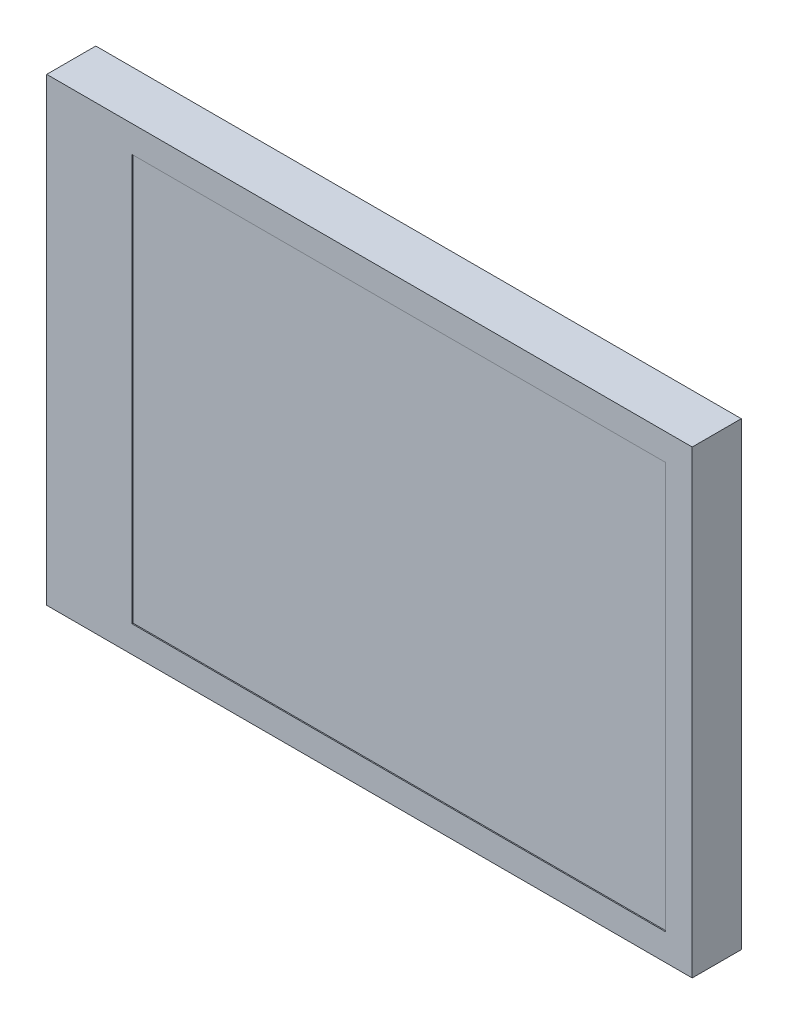
ISO-10303-21;
HEADER;
FILE_DESCRIPTION(('STEP AP214'),'2;1');
FILE_NAME('part.step','',(''),(''),'','','');
FILE_SCHEMA(('AUTOMOTIVE_DESIGN { 1 0 10303 214 1 1 1 1 }'));
ENDSEC;
DATA;
#1=APPLICATION_CONTEXT('core data for automotive mechanical design processes');
#2=APPLICATION_PROTOCOL_DEFINITION('international standard','automotive_design',2000,#1);
#3=PRODUCT_CONTEXT('',#1,'mechanical');
#4=PRODUCT('Part','Part','',(#3));
#5=PRODUCT_RELATED_PRODUCT_CATEGORY('part','',(#4));
#6=PRODUCT_DEFINITION_FORMATION('','',#4);
#7=PRODUCT_DEFINITION_CONTEXT('part definition',#1,'design');
#8=PRODUCT_DEFINITION('design','',#6,#7);
#9=PRODUCT_DEFINITION_SHAPE('','',#8);
#10=(LENGTH_UNIT() NAMED_UNIT(*) SI_UNIT(.MILLI.,.METRE.));
#11=(NAMED_UNIT(*) PLANE_ANGLE_UNIT() SI_UNIT($,.RADIAN.));
#12=(NAMED_UNIT(*) SI_UNIT($,.STERADIAN.) SOLID_ANGLE_UNIT());
#13=UNCERTAINTY_MEASURE_WITH_UNIT(LENGTH_MEASURE(1.E-05),#10,'distance_accuracy_value','');
#14=(GEOMETRIC_REPRESENTATION_CONTEXT(3) GLOBAL_UNCERTAINTY_ASSIGNED_CONTEXT((#13)) GLOBAL_UNIT_ASSIGNED_CONTEXT((#10,
#11,#12)) REPRESENTATION_CONTEXT('',''));
#15=CARTESIAN_POINT('',(0.,0.,0.));
#16=DIRECTION('',(0.,0.,1.));
#17=DIRECTION('',(1.,0.,0.));
#18=AXIS2_PLACEMENT_3D('',#15,#16,#17);
#19=CARTESIAN_POINT('',(28.25,-21.55,-2.));
#20=DIRECTION('',(-1.,0.,0.));
#21=DIRECTION('',(0.,-1.,0.));
#22=AXIS2_PLACEMENT_3D('',#19,#20,#21);
#23=PLANE('',#22);
#24=DIRECTION('',(0.,-1.,0.));
#25=VECTOR('',#24,1.);
#26=CARTESIAN_POINT('',(28.25,-21.55,0.));
#27=LINE('',#26,#25);
#28=CARTESIAN_POINT('',(28.25,-6.25,0.));
#29=VERTEX_POINT('',#28);
#30=CARTESIAN_POINT('',(28.25,-21.55,0.));
#31=VERTEX_POINT('',#30);
#32=EDGE_CURVE('E108',#29,#31,#27,.T.);
#33=ORIENTED_EDGE('',*,*,#32,.T.);
#34=DIRECTION('',(0.,0.,1.));
#35=VECTOR('',#34,1.);
#36=CARTESIAN_POINT('',(28.25,-21.55,-2.));
#37=LINE('',#36,#35);
#38=CARTESIAN_POINT('',(28.25,-21.55,-2.));
#39=VERTEX_POINT('',#38);
#40=EDGE_CURVE('E12',#39,#31,#37,.T.);
#41=ORIENTED_EDGE('',*,*,#40,.F.);
#42=DIRECTION('',(0.,-1.,0.));
#43=VECTOR('',#42,1.);
#44=CARTESIAN_POINT('',(28.25,-21.55,-2.));
#45=LINE('',#44,#43);
#46=CARTESIAN_POINT('',(28.25,-6.25,-2.));
#47=VERTEX_POINT('',#46);
#48=EDGE_CURVE('E96',#47,#39,#45,.T.);
#49=ORIENTED_EDGE('',*,*,#48,.F.);
#50=DIRECTION('',(0.,0.,1.));
#51=VECTOR('',#50,1.);
#52=CARTESIAN_POINT('',(28.25,-6.25,-2.));
#53=LINE('',#52,#51);
#54=EDGE_CURVE('E104',#47,#29,#53,.T.);
#55=ORIENTED_EDGE('',*,*,#54,.T.);
#56=EDGE_LOOP('',(#33,#41,#49,#55));
#57=FACE_BOUND('',#56,.T.);
#58=ADVANCED_FACE('F45',(#57),#23,.F.);
#59=CARTESIAN_POINT('',(28.25,-21.55,-2.));
#60=DIRECTION('',(0.,1.,0.));
#61=DIRECTION('',(0.,0.,1.));
#62=AXIS2_PLACEMENT_3D('',#59,#60,#61);
#63=PLANE('',#62);
#64=DIRECTION('',(-1.,0.,0.));
#65=VECTOR('',#64,1.);
#66=CARTESIAN_POINT('',(28.25,-21.55,0.));
#67=LINE('',#66,#65);
#68=CARTESIAN_POINT('',(13.45,-21.55,0.));
#69=VERTEX_POINT('',#68);
#70=EDGE_CURVE('E100',#31,#69,#67,.T.);
#71=ORIENTED_EDGE('',*,*,#70,.T.);
#72=DIRECTION('',(0.,0.,1.));
#73=VECTOR('',#72,1.);
#74=CARTESIAN_POINT('',(13.45,-21.55,-2.));
#75=LINE('',#74,#73);
#76=CARTESIAN_POINT('',(13.45,-21.55,-2.));
#77=VERTEX_POINT('',#76);
#78=EDGE_CURVE('E53',#77,#69,#75,.T.);
#79=ORIENTED_EDGE('',*,*,#78,.F.);
#80=DIRECTION('',(-1.,0.,0.));
#81=VECTOR('',#80,1.);
#82=CARTESIAN_POINT('',(28.25,-21.55,-2.));
#83=LINE('',#82,#81);
#84=EDGE_CURVE('E91',#39,#77,#83,.T.);
#85=ORIENTED_EDGE('',*,*,#84,.F.);
#86=ORIENTED_EDGE('',*,*,#40,.T.);
#87=EDGE_LOOP('',(#71,#79,#85,#86));
#88=FACE_BOUND('',#87,.T.);
#89=ADVANCED_FACE('F99',(#88),#63,.F.);
#90=CARTESIAN_POINT('',(13.45,-21.55,-2.));
#91=DIRECTION('',(1.,0.,0.));
#92=DIRECTION('',(0.,0.,-1.));
#93=AXIS2_PLACEMENT_3D('',#90,#91,#92);
#94=PLANE('',#93);
#95=DIRECTION('',(0.,1.,0.));
#96=VECTOR('',#95,1.);
#97=CARTESIAN_POINT('',(13.45,-21.55,0.));
#98=LINE('',#97,#96);
#99=CARTESIAN_POINT('',(13.45,-6.25,0.));
#100=VERTEX_POINT('',#99);
#101=EDGE_CURVE('E78',#69,#100,#98,.T.);
#102=ORIENTED_EDGE('',*,*,#101,.T.);
#103=DIRECTION('',(0.,0.,1.));
#104=VECTOR('',#103,1.);
#105=CARTESIAN_POINT('',(13.45,-6.25,-2.));
#106=LINE('',#105,#104);
#107=CARTESIAN_POINT('',(13.45,-6.25,-2.));
#108=VERTEX_POINT('',#107);
#109=EDGE_CURVE('E101',#108,#100,#106,.T.);
#110=ORIENTED_EDGE('',*,*,#109,.F.);
#111=DIRECTION('',(0.,1.,0.));
#112=VECTOR('',#111,1.);
#113=CARTESIAN_POINT('',(13.45,-21.55,-2.));
#114=LINE('',#113,#112);
#115=EDGE_CURVE('E94',#77,#108,#114,.T.);
#116=ORIENTED_EDGE('',*,*,#115,.F.);
#117=ORIENTED_EDGE('',*,*,#78,.T.);
#118=EDGE_LOOP('',(#102,#110,#116,#117));
#119=FACE_BOUND('',#118,.T.);
#120=ADVANCED_FACE('F102',(#119),#94,.F.);
#121=CARTESIAN_POINT('',(28.25,-6.25,-2.));
#122=DIRECTION('',(0.,-1.,0.));
#123=DIRECTION('',(0.,0.,-1.));
#124=AXIS2_PLACEMENT_3D('',#121,#122,#123);
#125=PLANE('',#124);
#126=DIRECTION('',(1.,0.,0.));
#127=VECTOR('',#126,1.);
#128=CARTESIAN_POINT('',(28.25,-6.25,0.));
#129=LINE('',#128,#127);
#130=EDGE_CURVE('E84',#100,#29,#129,.T.);
#131=ORIENTED_EDGE('',*,*,#130,.T.);
#132=ORIENTED_EDGE('',*,*,#54,.F.);
#133=DIRECTION('',(1.,0.,0.));
#134=VECTOR('',#133,1.);
#135=CARTESIAN_POINT('',(28.25,-6.25,-2.));
#136=LINE('',#135,#134);
#137=EDGE_CURVE('E61',#108,#47,#136,.T.);
#138=ORIENTED_EDGE('',*,*,#137,.F.);
#139=ORIENTED_EDGE('',*,*,#109,.T.);
#140=EDGE_LOOP('',(#131,#132,#138,#139));
#141=FACE_BOUND('',#140,.T.);
#142=ADVANCED_FACE('F115',(#141),#125,.F.);
#143=CARTESIAN_POINT('',(0.,0.,-2.));
#144=DIRECTION('',(0.,0.,1.));
#145=DIRECTION('',(1.,0.,0.));
#146=AXIS2_PLACEMENT_3D('',#143,#144,#145);
#147=PLANE('',#146);
#148=ORIENTED_EDGE('',*,*,#48,.T.);
#149=ORIENTED_EDGE('',*,*,#84,.T.);
#150=ORIENTED_EDGE('',*,*,#115,.T.);
#151=ORIENTED_EDGE('',*,*,#137,.T.);
#152=EDGE_LOOP('',(#148,#149,#150,#151));
#153=FACE_BOUND('',#152,.T.);
#154=ADVANCED_FACE('F92',(#153),#147,.F.);
#155=CARTESIAN_POINT('',(0.,0.,0.));
#156=DIRECTION('',(0.,0.,1.));
#157=DIRECTION('',(1.,0.,0.));
#158=AXIS2_PLACEMENT_3D('',#155,#156,#157);
#159=PLANE('',#158);
#160=ORIENTED_EDGE('',*,*,#32,.F.);
#161=ORIENTED_EDGE('',*,*,#130,.F.);
#162=ORIENTED_EDGE('',*,*,#101,.F.);
#163=ORIENTED_EDGE('',*,*,#70,.F.);
#164=EDGE_LOOP('',(#160,#161,#162,#163));
#165=FACE_BOUND('',#164,.T.);
#166=ADVANCED_FACE('F118',(#165),#159,.T.);
#167=CLOSED_SHELL('',(#58,#89,#120,#142,#154,#166));
#168=MANIFOLD_SOLID_BREP('B2',#167);
#169=CARTESIAN_POINT('',(-30.25,14.65,-4.1));
#170=DIRECTION('',(1.,0.,0.));
#171=DIRECTION('',(0.,1.,0.));
#172=AXIS2_PLACEMENT_3D('',#169,#170,#171);
#173=PLANE('',#172);
#174=DIRECTION('',(0.,1.,0.));
#175=VECTOR('',#174,1.);
#176=CARTESIAN_POINT('',(-30.25,14.65,0.));
#177=LINE('',#176,#175);
#178=CARTESIAN_POINT('',(-30.25,-2.95,0.));
#179=VERTEX_POINT('',#178);
#180=CARTESIAN_POINT('',(-30.25,14.65,0.));
#181=VERTEX_POINT('',#180);
#182=EDGE_CURVE('E241',#179,#181,#177,.T.);
#183=ORIENTED_EDGE('',*,*,#182,.T.);
#184=DIRECTION('',(0.,0.,1.));
#185=VECTOR('',#184,1.);
#186=CARTESIAN_POINT('',(-30.25,14.65,-4.1));
#187=LINE('',#186,#185);
#188=CARTESIAN_POINT('',(-30.25,14.65,-4.1));
#189=VERTEX_POINT('',#188);
#190=EDGE_CURVE('E43',#189,#181,#187,.T.);
#191=ORIENTED_EDGE('',*,*,#190,.F.);
#192=DIRECTION('',(0.,1.,0.));
#193=VECTOR('',#192,1.);
#194=CARTESIAN_POINT('',(-30.25,14.65,-4.1));
#195=LINE('',#194,#193);
#196=CARTESIAN_POINT('',(-30.25,-2.95,-4.1));
#197=VERTEX_POINT('',#196);
#198=EDGE_CURVE('E229',#197,#189,#195,.T.);
#199=ORIENTED_EDGE('',*,*,#198,.F.);
#200=DIRECTION('',(0.,0.,1.));
#201=VECTOR('',#200,1.);
#202=CARTESIAN_POINT('',(-30.25,-2.95,-4.1));
#203=LINE('',#202,#201);
#204=EDGE_CURVE('E237',#197,#179,#203,.T.);
#205=ORIENTED_EDGE('',*,*,#204,.T.);
#206=EDGE_LOOP('',(#183,#191,#199,#205));
#207=FACE_BOUND('',#206,.T.);
#208=ADVANCED_FACE('F178',(#207),#173,.F.);
#209=CARTESIAN_POINT('',(-30.25,14.65,-4.1));
#210=DIRECTION('',(0.,-1.,0.));
#211=DIRECTION('',(0.,0.,-1.));
#212=AXIS2_PLACEMENT_3D('',#209,#210,#211);
#213=PLANE('',#212);
#214=DIRECTION('',(1.,0.,0.));
#215=VECTOR('',#214,1.);
#216=CARTESIAN_POINT('',(-30.25,14.65,0.));
#217=LINE('',#216,#215);
#218=CARTESIAN_POINT('',(-24.65,14.65,0.));
#219=VERTEX_POINT('',#218);
#220=EDGE_CURVE('E233',#181,#219,#217,.T.);
#221=ORIENTED_EDGE('',*,*,#220,.T.);
#222=DIRECTION('',(0.,0.,1.));
#223=VECTOR('',#222,1.);
#224=CARTESIAN_POINT('',(-24.65,14.65,-4.1));
#225=LINE('',#224,#223);
#226=CARTESIAN_POINT('',(-24.65,14.65,-4.1));
#227=VERTEX_POINT('',#226);
#228=EDGE_CURVE('E186',#227,#219,#225,.T.);
#229=ORIENTED_EDGE('',*,*,#228,.F.);
#230=DIRECTION('',(1.,0.,0.));
#231=VECTOR('',#230,1.);
#232=CARTESIAN_POINT('',(-30.25,14.65,-4.1));
#233=LINE('',#232,#231);
#234=EDGE_CURVE('E224',#189,#227,#233,.T.);
#235=ORIENTED_EDGE('',*,*,#234,.F.);
#236=ORIENTED_EDGE('',*,*,#190,.T.);
#237=EDGE_LOOP('',(#221,#229,#235,#236));
#238=FACE_BOUND('',#237,.T.);
#239=ADVANCED_FACE('F232',(#238),#213,.F.);
#240=CARTESIAN_POINT('',(-24.65,14.65,-4.1));
#241=DIRECTION('',(-1.,0.,0.));
#242=DIRECTION('',(0.,-1.,0.));
#243=AXIS2_PLACEMENT_3D('',#240,#241,#242);
#244=PLANE('',#243);
#245=DIRECTION('',(0.,-1.,0.));
#246=VECTOR('',#245,1.);
#247=CARTESIAN_POINT('',(-24.65,14.65,0.));
#248=LINE('',#247,#246);
#249=CARTESIAN_POINT('',(-24.65,-2.95,0.));
#250=VERTEX_POINT('',#249);
#251=EDGE_CURVE('E211',#219,#250,#248,.T.);
#252=ORIENTED_EDGE('',*,*,#251,.T.);
#253=DIRECTION('',(0.,0.,1.));
#254=VECTOR('',#253,1.);
#255=CARTESIAN_POINT('',(-24.65,-2.95,-4.1));
#256=LINE('',#255,#254);
#257=CARTESIAN_POINT('',(-24.65,-2.95,-4.1));
#258=VERTEX_POINT('',#257);
#259=EDGE_CURVE('E234',#258,#250,#256,.T.);
#260=ORIENTED_EDGE('',*,*,#259,.F.);
#261=DIRECTION('',(0.,-1.,0.));
#262=VECTOR('',#261,1.);
#263=CARTESIAN_POINT('',(-24.65,14.65,-4.1));
#264=LINE('',#263,#262);
#265=EDGE_CURVE('E227',#227,#258,#264,.T.);
#266=ORIENTED_EDGE('',*,*,#265,.F.);
#267=ORIENTED_EDGE('',*,*,#228,.T.);
#268=EDGE_LOOP('',(#252,#260,#266,#267));
#269=FACE_BOUND('',#268,.T.);
#270=ADVANCED_FACE('F235',(#269),#244,.F.);
#271=CARTESIAN_POINT('',(-30.25,-2.95,-4.1));
#272=DIRECTION('',(0.,1.,0.));
#273=DIRECTION('',(-1.,0.,0.));
#274=AXIS2_PLACEMENT_3D('',#271,#272,#273);
#275=PLANE('',#274);
#276=DIRECTION('',(-1.,0.,0.));
#277=VECTOR('',#276,1.);
#278=CARTESIAN_POINT('',(-30.25,-2.95,0.));
#279=LINE('',#278,#277);
#280=EDGE_CURVE('E217',#250,#179,#279,.T.);
#281=ORIENTED_EDGE('',*,*,#280,.T.);
#282=ORIENTED_EDGE('',*,*,#204,.F.);
#283=DIRECTION('',(-1.,0.,0.));
#284=VECTOR('',#283,1.);
#285=CARTESIAN_POINT('',(-30.25,-2.95,-4.1));
#286=LINE('',#285,#284);
#287=EDGE_CURVE('E194',#258,#197,#286,.T.);
#288=ORIENTED_EDGE('',*,*,#287,.F.);
#289=ORIENTED_EDGE('',*,*,#259,.T.);
#290=EDGE_LOOP('',(#281,#282,#288,#289));
#291=FACE_BOUND('',#290,.T.);
#292=ADVANCED_FACE('F248',(#291),#275,.F.);
#293=CARTESIAN_POINT('',(0.,0.,-4.1));
#294=DIRECTION('',(0.,0.,1.));
#295=DIRECTION('',(1.,0.,0.));
#296=AXIS2_PLACEMENT_3D('',#293,#294,#295);
#297=PLANE('',#296);
#298=ORIENTED_EDGE('',*,*,#198,.T.);
#299=ORIENTED_EDGE('',*,*,#234,.T.);
#300=ORIENTED_EDGE('',*,*,#265,.T.);
#301=ORIENTED_EDGE('',*,*,#287,.T.);
#302=EDGE_LOOP('',(#298,#299,#300,#301));
#303=FACE_BOUND('',#302,.T.);
#304=ADVANCED_FACE('F225',(#303),#297,.F.);
#305=CARTESIAN_POINT('',(0.,0.,0.));
#306=DIRECTION('',(0.,0.,1.));
#307=DIRECTION('',(1.,0.,0.));
#308=AXIS2_PLACEMENT_3D('',#305,#306,#307);
#309=PLANE('',#308);
#310=ORIENTED_EDGE('',*,*,#182,.F.);
#311=ORIENTED_EDGE('',*,*,#280,.F.);
#312=ORIENTED_EDGE('',*,*,#251,.F.);
#313=ORIENTED_EDGE('',*,*,#220,.F.);
#314=EDGE_LOOP('',(#310,#311,#312,#313));
#315=FACE_BOUND('',#314,.T.);
#316=ADVANCED_FACE('F251',(#315),#309,.T.);
#317=CLOSED_SHELL('',(#208,#239,#270,#292,#304,#316));
#318=MANIFOLD_SOLID_BREP('B6',#317);
#319=CARTESIAN_POINT('',(-20.75,-21.55,-2.5));
#320=DIRECTION('',(-1.,0.,0.));
#321=DIRECTION('',(0.,0.,1.));
#322=AXIS2_PLACEMENT_3D('',#319,#320,#321);
#323=PLANE('',#322);
#324=DIRECTION('',(0.,-1.,0.));
#325=VECTOR('',#324,1.);
#326=CARTESIAN_POINT('',(-20.75,-21.55,0.));
#327=LINE('',#326,#325);
#328=CARTESIAN_POINT('',(-20.75,-16.25,0.));
#329=VERTEX_POINT('',#328);
#330=CARTESIAN_POINT('',(-20.75,-21.55,0.));
#331=VERTEX_POINT('',#330);
#332=EDGE_CURVE('E373',#329,#331,#327,.T.);
#333=ORIENTED_EDGE('',*,*,#332,.T.);
#334=DIRECTION('',(0.,0.,1.));
#335=VECTOR('',#334,1.);
#336=CARTESIAN_POINT('',(-20.75,-21.55,-2.5));
#337=LINE('',#336,#335);
#338=CARTESIAN_POINT('',(-20.75,-21.55,-2.5));
#339=VERTEX_POINT('',#338);
#340=EDGE_CURVE('E176',#339,#331,#337,.T.);
#341=ORIENTED_EDGE('',*,*,#340,.F.);
#342=DIRECTION('',(0.,-1.,0.));
#343=VECTOR('',#342,1.);
#344=CARTESIAN_POINT('',(-20.75,-21.55,-2.5));
#345=LINE('',#344,#343);
#346=CARTESIAN_POINT('',(-20.75,-16.25,-2.5));
#347=VERTEX_POINT('',#346);
#348=EDGE_CURVE('E361',#347,#339,#345,.T.);
#349=ORIENTED_EDGE('',*,*,#348,.F.);
#350=DIRECTION('',(0.,0.,1.));
#351=VECTOR('',#350,1.);
#352=CARTESIAN_POINT('',(-20.75,-16.25,-2.5));
#353=LINE('',#352,#351);
#354=EDGE_CURVE('E369',#347,#329,#353,.T.);
#355=ORIENTED_EDGE('',*,*,#354,.T.);
#356=EDGE_LOOP('',(#333,#341,#349,#355));
#357=FACE_BOUND('',#356,.T.);
#358=ADVANCED_FACE('F310',(#357),#323,.F.);
#359=CARTESIAN_POINT('',(-20.75,-21.55,-2.5));
#360=DIRECTION('',(0.,1.,0.));
#361=DIRECTION('',(0.,0.,1.));
#362=AXIS2_PLACEMENT_3D('',#359,#360,#361);
#363=PLANE('',#362);
#364=DIRECTION('',(-1.,0.,0.));
#365=VECTOR('',#364,1.);
#366=CARTESIAN_POINT('',(-20.75,-21.55,0.));
#367=LINE('',#366,#365);
#368=CARTESIAN_POINT('',(-28.25,-21.55,0.));
#369=VERTEX_POINT('',#368);
#370=EDGE_CURVE('E365',#331,#369,#367,.T.);
#371=ORIENTED_EDGE('',*,*,#370,.T.);
#372=DIRECTION('',(0.,0.,1.));
#373=VECTOR('',#372,1.);
#374=CARTESIAN_POINT('',(-28.25,-21.55,-2.5));
#375=LINE('',#374,#373);
#376=CARTESIAN_POINT('',(-28.25,-21.55,-2.5));
#377=VERTEX_POINT('',#376);
#378=EDGE_CURVE('E318',#377,#369,#375,.T.);
#379=ORIENTED_EDGE('',*,*,#378,.F.);
#380=DIRECTION('',(-1.,0.,0.));
#381=VECTOR('',#380,1.);
#382=CARTESIAN_POINT('',(-20.75,-21.55,-2.5));
#383=LINE('',#382,#381);
#384=EDGE_CURVE('E356',#339,#377,#383,.T.);
#385=ORIENTED_EDGE('',*,*,#384,.F.);
#386=ORIENTED_EDGE('',*,*,#340,.T.);
#387=EDGE_LOOP('',(#371,#379,#385,#386));
#388=FACE_BOUND('',#387,.T.);
#389=ADVANCED_FACE('F364',(#388),#363,.F.);
#390=CARTESIAN_POINT('',(-28.25,-21.55,-2.5));
#391=DIRECTION('',(1.,0.,0.));
#392=DIRECTION('',(0.,0.,-1.));
#393=AXIS2_PLACEMENT_3D('',#390,#391,#392);
#394=PLANE('',#393);
#395=DIRECTION('',(0.,1.,0.));
#396=VECTOR('',#395,1.);
#397=CARTESIAN_POINT('',(-28.25,-21.55,0.));
#398=LINE('',#397,#396);
#399=CARTESIAN_POINT('',(-28.25,-16.25,0.));
#400=VERTEX_POINT('',#399);
#401=EDGE_CURVE('E343',#369,#400,#398,.T.);
#402=ORIENTED_EDGE('',*,*,#401,.T.);
#403=DIRECTION('',(0.,0.,1.));
#404=VECTOR('',#403,1.);
#405=CARTESIAN_POINT('',(-28.25,-16.25,-2.5));
#406=LINE('',#405,#404);
#407=CARTESIAN_POINT('',(-28.25,-16.25,-2.5));
#408=VERTEX_POINT('',#407);
#409=EDGE_CURVE('E366',#408,#400,#406,.T.);
#410=ORIENTED_EDGE('',*,*,#409,.F.);
#411=DIRECTION('',(0.,1.,0.));
#412=VECTOR('',#411,1.);
#413=CARTESIAN_POINT('',(-28.25,-21.55,-2.5));
#414=LINE('',#413,#412);
#415=EDGE_CURVE('E359',#377,#408,#414,.T.);
#416=ORIENTED_EDGE('',*,*,#415,.F.);
#417=ORIENTED_EDGE('',*,*,#378,.T.);
#418=EDGE_LOOP('',(#402,#410,#416,#417));
#419=FACE_BOUND('',#418,.T.);
#420=ADVANCED_FACE('F367',(#419),#394,.F.);
#421=CARTESIAN_POINT('',(-20.75,-16.25,-2.5));
#422=DIRECTION('',(0.,-1.,0.));
#423=DIRECTION('',(0.,0.,-1.));
#424=AXIS2_PLACEMENT_3D('',#421,#422,#423);
#425=PLANE('',#424);
#426=DIRECTION('',(1.,0.,0.));
#427=VECTOR('',#426,1.);
#428=CARTESIAN_POINT('',(-20.75,-16.25,0.));
#429=LINE('',#428,#427);
#430=EDGE_CURVE('E349',#400,#329,#429,.T.);
#431=ORIENTED_EDGE('',*,*,#430,.T.);
#432=ORIENTED_EDGE('',*,*,#354,.F.);
#433=DIRECTION('',(1.,0.,0.));
#434=VECTOR('',#433,1.);
#435=CARTESIAN_POINT('',(-20.75,-16.25,-2.5));
#436=LINE('',#435,#434);
#437=EDGE_CURVE('E326',#408,#347,#436,.T.);
#438=ORIENTED_EDGE('',*,*,#437,.F.);
#439=ORIENTED_EDGE('',*,*,#409,.T.);
#440=EDGE_LOOP('',(#431,#432,#438,#439));
#441=FACE_BOUND('',#440,.T.);
#442=ADVANCED_FACE('F380',(#441),#425,.F.);
#443=CARTESIAN_POINT('',(0.,0.,-2.5));
#444=DIRECTION('',(0.,0.,1.));
#445=DIRECTION('',(1.,0.,0.));
#446=AXIS2_PLACEMENT_3D('',#443,#444,#445);
#447=PLANE('',#446);
#448=ORIENTED_EDGE('',*,*,#348,.T.);
#449=ORIENTED_EDGE('',*,*,#384,.T.);
#450=ORIENTED_EDGE('',*,*,#415,.T.);
#451=ORIENTED_EDGE('',*,*,#437,.T.);
#452=EDGE_LOOP('',(#448,#449,#450,#451));
#453=FACE_BOUND('',#452,.T.);
#454=ADVANCED_FACE('F357',(#453),#447,.F.);
#455=CARTESIAN_POINT('',(0.,0.,0.));
#456=DIRECTION('',(0.,0.,1.));
#457=DIRECTION('',(1.,0.,0.));
#458=AXIS2_PLACEMENT_3D('',#455,#456,#457);
#459=PLANE('',#458);
#460=ORIENTED_EDGE('',*,*,#332,.F.);
#461=ORIENTED_EDGE('',*,*,#430,.F.);
#462=ORIENTED_EDGE('',*,*,#401,.F.);
#463=ORIENTED_EDGE('',*,*,#370,.F.);
#464=EDGE_LOOP('',(#460,#461,#462,#463));
#465=FACE_BOUND('',#464,.T.);
#466=ADVANCED_FACE('F383',(#465),#459,.T.);
#467=CLOSED_SHELL('',(#358,#389,#420,#442,#454,#466));
#468=MANIFOLD_SOLID_BREP('B37',#467);
#469=CARTESIAN_POINT('',(30.25,-21.55,4.6));
#470=DIRECTION('',(-1.,0.,0.));
#471=DIRECTION('',(0.,0.,1.));
#472=AXIS2_PLACEMENT_3D('',#469,#470,#471);
#473=PLANE('',#472);
#474=DIRECTION('',(0.,1.,0.));
#475=VECTOR('',#474,1.);
#476=CARTESIAN_POINT('',(30.25,-21.55,0.));
#477=LINE('',#476,#475);
#478=CARTESIAN_POINT('',(30.25,-21.55,0.));
#479=VERTEX_POINT('',#478);
#480=CARTESIAN_POINT('',(30.25,21.55,0.));
#481=VERTEX_POINT('',#480);
#482=EDGE_CURVE('E541',#479,#481,#477,.T.);
#483=ORIENTED_EDGE('',*,*,#482,.T.);
#484=DIRECTION('',(0.,0.,-1.));
#485=VECTOR('',#484,1.);
#486=CARTESIAN_POINT('',(30.25,21.55,4.6));
#487=LINE('',#486,#485);
#488=CARTESIAN_POINT('',(30.25,21.55,4.6));
#489=VERTEX_POINT('',#488);
#490=EDGE_CURVE('E308',#489,#481,#487,.T.);
#491=ORIENTED_EDGE('',*,*,#490,.F.);
#492=DIRECTION('',(0.,1.,0.));
#493=VECTOR('',#492,1.);
#494=CARTESIAN_POINT('',(30.25,-21.55,4.6));
#495=LINE('',#494,#493);
#496=CARTESIAN_POINT('',(30.25,-21.55,4.6));
#497=VERTEX_POINT('',#496);
#498=EDGE_CURVE('E545',#497,#489,#495,.T.);
#499=ORIENTED_EDGE('',*,*,#498,.F.);
#500=DIRECTION('',(0.,0.,-1.));
#501=VECTOR('',#500,1.);
#502=CARTESIAN_POINT('',(30.25,-21.55,4.6));
#503=LINE('',#502,#501);
#504=EDGE_CURVE('E551',#497,#479,#503,.T.);
#505=ORIENTED_EDGE('',*,*,#504,.T.);
#506=EDGE_LOOP('',(#483,#491,#499,#505));
#507=FACE_BOUND('',#506,.T.);
#508=ADVANCED_FACE('F433',(#507),#473,.F.);
#509=CARTESIAN_POINT('',(-30.25,21.55,4.6));
#510=DIRECTION('',(0.,-1.,0.));
#511=DIRECTION('',(0.,0.,-1.));
#512=AXIS2_PLACEMENT_3D('',#509,#510,#511);
#513=PLANE('',#512);
#514=DIRECTION('',(-1.,0.,0.));
#515=VECTOR('',#514,1.);
#516=CARTESIAN_POINT('',(-30.25,21.55,0.));
#517=LINE('',#516,#515);
#518=CARTESIAN_POINT('',(-30.25,21.55,0.));
#519=VERTEX_POINT('',#518);
#520=EDGE_CURVE('E554',#481,#519,#517,.T.);
#521=ORIENTED_EDGE('',*,*,#520,.T.);
#522=DIRECTION('',(0.,0.,-1.));
#523=VECTOR('',#522,1.);
#524=CARTESIAN_POINT('',(-30.25,21.55,4.6));
#525=LINE('',#524,#523);
#526=CARTESIAN_POINT('',(-30.25,21.55,4.6));
#527=VERTEX_POINT('',#526);
#528=EDGE_CURVE('E440',#527,#519,#525,.T.);
#529=ORIENTED_EDGE('',*,*,#528,.F.);
#530=DIRECTION('',(-1.,0.,0.));
#531=VECTOR('',#530,1.);
#532=CARTESIAN_POINT('',(-30.25,21.55,4.6));
#533=LINE('',#532,#531);
#534=EDGE_CURVE('E484',#489,#527,#533,.T.);
#535=ORIENTED_EDGE('',*,*,#534,.F.);
#536=ORIENTED_EDGE('',*,*,#490,.T.);
#537=EDGE_LOOP('',(#521,#529,#535,#536));
#538=FACE_BOUND('',#537,.T.);
#539=ADVANCED_FACE('F583',(#538),#513,.F.);
#540=CARTESIAN_POINT('',(-30.25,-21.55,4.6));
#541=DIRECTION('',(1.,0.,0.));
#542=DIRECTION('',(0.,0.,-1.));
#543=AXIS2_PLACEMENT_3D('',#540,#541,#542);
#544=PLANE('',#543);
#545=DIRECTION('',(0.,-1.,0.));
#546=VECTOR('',#545,1.);
#547=CARTESIAN_POINT('',(-30.25,-21.55,0.));
#548=LINE('',#547,#546);
#549=CARTESIAN_POINT('',(-30.25,-21.55,0.));
#550=VERTEX_POINT('',#549);
#551=EDGE_CURVE('E556',#519,#550,#548,.T.);
#552=ORIENTED_EDGE('',*,*,#551,.T.);
#553=DIRECTION('',(0.,0.,-1.));
#554=VECTOR('',#553,1.);
#555=CARTESIAN_POINT('',(-30.25,-21.55,4.6));
#556=LINE('',#555,#554);
#557=CARTESIAN_POINT('',(-30.25,-21.55,4.6));
#558=VERTEX_POINT('',#557);
#559=EDGE_CURVE('E560',#558,#550,#556,.T.);
#560=ORIENTED_EDGE('',*,*,#559,.F.);
#561=DIRECTION('',(0.,-1.,0.));
#562=VECTOR('',#561,1.);
#563=CARTESIAN_POINT('',(-30.25,-21.55,4.6));
#564=LINE('',#563,#562);
#565=EDGE_CURVE('E548',#527,#558,#564,.T.);
#566=ORIENTED_EDGE('',*,*,#565,.F.);
#567=ORIENTED_EDGE('',*,*,#528,.T.);
#568=EDGE_LOOP('',(#552,#560,#566,#567));
#569=FACE_BOUND('',#568,.T.);
#570=ADVANCED_FACE('F565',(#569),#544,.F.);
#571=CARTESIAN_POINT('',(-30.25,-21.55,4.6));
#572=DIRECTION('',(0.,1.,0.));
#573=DIRECTION('',(0.,0.,1.));
#574=AXIS2_PLACEMENT_3D('',#571,#572,#573);
#575=PLANE('',#574);
#576=DIRECTION('',(1.,0.,0.));
#577=VECTOR('',#576,1.);
#578=CARTESIAN_POINT('',(-30.25,-21.55,0.));
#579=LINE('',#578,#577);
#580=EDGE_CURVE('E477',#550,#479,#579,.T.);
#581=ORIENTED_EDGE('',*,*,#580,.T.);
#582=ORIENTED_EDGE('',*,*,#504,.F.);
#583=DIRECTION('',(1.,0.,0.));
#584=VECTOR('',#583,1.);
#585=CARTESIAN_POINT('',(-30.25,-21.55,4.6));
#586=LINE('',#585,#584);
#587=EDGE_CURVE('E456',#558,#497,#586,.T.);
#588=ORIENTED_EDGE('',*,*,#587,.F.);
#589=ORIENTED_EDGE('',*,*,#559,.T.);
#590=EDGE_LOOP('',(#581,#582,#588,#589));
#591=FACE_BOUND('',#590,.T.);
#592=ADVANCED_FACE('F573',(#591),#575,.F.);
#593=CARTESIAN_POINT('',(0.,0.,4.6));
#594=DIRECTION('',(0.,0.,-1.));
#595=DIRECTION('',(-1.,0.,0.));
#596=AXIS2_PLACEMENT_3D('',#593,#594,#595);
#597=PLANE('',#596);
#598=DIRECTION('',(1.,0.,0.));
#599=VECTOR('',#598,1.);
#600=CARTESIAN_POINT('',(-22.25,-19.05,4.6));
#601=LINE('',#600,#599);
#602=CARTESIAN_POINT('',(-22.25,-19.05,4.6));
#603=VERTEX_POINT('',#602);
#604=CARTESIAN_POINT('',(27.75,-19.05,4.6));
#605=VERTEX_POINT('',#604);
#606=EDGE_CURVE('E535',#603,#605,#601,.T.);
#607=ORIENTED_EDGE('',*,*,#606,.F.);
#608=DIRECTION('',(0.,-1.,0.));
#609=VECTOR('',#608,1.);
#610=CARTESIAN_POINT('',(-22.25,19.05,4.6));
#611=LINE('',#610,#609);
#612=CARTESIAN_POINT('',(-22.25,19.05,4.6));
#613=VERTEX_POINT('',#612);
#614=EDGE_CURVE('E447',#613,#603,#611,.T.);
#615=ORIENTED_EDGE('',*,*,#614,.F.);
#616=DIRECTION('',(-1.,0.,0.));
#617=VECTOR('',#616,1.);
#618=CARTESIAN_POINT('',(-22.25,19.05,4.6));
#619=LINE('',#618,#617);
#620=CARTESIAN_POINT('',(27.75,19.05,4.6));
#621=VERTEX_POINT('',#620);
#622=EDGE_CURVE('E526',#621,#613,#619,.T.);
#623=ORIENTED_EDGE('',*,*,#622,.F.);
#624=DIRECTION('',(0.,1.,0.));
#625=VECTOR('',#624,1.);
#626=CARTESIAN_POINT('',(27.75,19.05,4.6));
#627=LINE('',#626,#625);
#628=EDGE_CURVE('E529',#605,#621,#627,.T.);
#629=ORIENTED_EDGE('',*,*,#628,.F.);
#630=EDGE_LOOP('',(#607,#615,#623,#629));
#631=FACE_BOUND('',#630,.T.);
#632=ORIENTED_EDGE('',*,*,#498,.T.);
#633=ORIENTED_EDGE('',*,*,#534,.T.);
#634=ORIENTED_EDGE('',*,*,#565,.T.);
#635=ORIENTED_EDGE('',*,*,#587,.T.);
#636=EDGE_LOOP('',(#632,#633,#634,#635));
#637=FACE_BOUND('',#636,.T.);
#638=ADVANCED_FACE('F575',(#631,#637),#597,.F.);
#639=CARTESIAN_POINT('',(0.,0.,0.));
#640=DIRECTION('',(0.,0.,-1.));
#641=DIRECTION('',(-1.,0.,0.));
#642=AXIS2_PLACEMENT_3D('',#639,#640,#641);
#643=PLANE('',#642);
#644=ORIENTED_EDGE('',*,*,#482,.F.);
#645=ORIENTED_EDGE('',*,*,#580,.F.);
#646=ORIENTED_EDGE('',*,*,#551,.F.);
#647=ORIENTED_EDGE('',*,*,#520,.F.);
#648=EDGE_LOOP('',(#644,#645,#646,#647));
#649=FACE_BOUND('',#648,.T.);
#650=ADVANCED_FACE('F569',(#649),#643,.T.);
#651=CARTESIAN_POINT('',(-22.25,19.05,4.5));
#652=DIRECTION('',(-1.,0.,0.));
#653=DIRECTION('',(0.,-1.,0.));
#654=AXIS2_PLACEMENT_3D('',#651,#652,#653);
#655=PLANE('',#654);
#656=ORIENTED_EDGE('',*,*,#614,.T.);
#657=DIRECTION('',(0.,0.,1.));
#658=VECTOR('',#657,1.);
#659=CARTESIAN_POINT('',(-22.25,-19.05,4.5));
#660=LINE('',#659,#658);
#661=CARTESIAN_POINT('',(-22.25,-19.05,4.5));
#662=VERTEX_POINT('',#661);
#663=EDGE_CURVE('E504',#662,#603,#660,.T.);
#664=ORIENTED_EDGE('',*,*,#663,.F.);
#665=DIRECTION('',(0.,-1.,0.));
#666=VECTOR('',#665,1.);
#667=CARTESIAN_POINT('',(-22.25,19.05,4.5));
#668=LINE('',#667,#666);
#669=CARTESIAN_POINT('',(-22.25,19.05,4.5));
#670=VERTEX_POINT('',#669);
#671=EDGE_CURVE('E508',#670,#662,#668,.T.);
#672=ORIENTED_EDGE('',*,*,#671,.F.);
#673=DIRECTION('',(0.,0.,1.));
#674=VECTOR('',#673,1.);
#675=CARTESIAN_POINT('',(-22.25,19.05,4.5));
#676=LINE('',#675,#674);
#677=EDGE_CURVE('E539',#670,#613,#676,.T.);
#678=ORIENTED_EDGE('',*,*,#677,.T.);
#679=EDGE_LOOP('',(#656,#664,#672,#678));
#680=FACE_BOUND('',#679,.T.);
#681=ADVANCED_FACE('F506',(#680),#655,.F.);
#682=CARTESIAN_POINT('',(-22.25,19.05,4.5));
#683=DIRECTION('',(0.,1.,0.));
#684=DIRECTION('',(0.,0.,1.));
#685=AXIS2_PLACEMENT_3D('',#682,#683,#684);
#686=PLANE('',#685);
#687=ORIENTED_EDGE('',*,*,#622,.T.);
#688=ORIENTED_EDGE('',*,*,#677,.F.);
#689=DIRECTION('',(-1.,0.,0.));
#690=VECTOR('',#689,1.);
#691=CARTESIAN_POINT('',(-22.25,19.05,4.5));
#692=LINE('',#691,#690);
#693=CARTESIAN_POINT('',(27.75,19.05,4.5));
#694=VERTEX_POINT('',#693);
#695=EDGE_CURVE('E514',#694,#670,#692,.T.);
#696=ORIENTED_EDGE('',*,*,#695,.F.);
#697=DIRECTION('',(0.,0.,1.));
#698=VECTOR('',#697,1.);
#699=CARTESIAN_POINT('',(27.75,19.05,4.5));
#700=LINE('',#699,#698);
#701=EDGE_CURVE('E542',#694,#621,#700,.T.);
#702=ORIENTED_EDGE('',*,*,#701,.T.);
#703=EDGE_LOOP('',(#687,#688,#696,#702));
#704=FACE_BOUND('',#703,.T.);
#705=ADVANCED_FACE('F622',(#704),#686,.F.);
#706=CARTESIAN_POINT('',(27.75,19.05,4.5));
#707=DIRECTION('',(1.,0.,0.));
#708=DIRECTION('',(0.,1.,0.));
#709=AXIS2_PLACEMENT_3D('',#706,#707,#708);
#710=PLANE('',#709);
#711=ORIENTED_EDGE('',*,*,#628,.T.);
#712=ORIENTED_EDGE('',*,*,#701,.F.);
#713=DIRECTION('',(0.,1.,0.));
#714=VECTOR('',#713,1.);
#715=CARTESIAN_POINT('',(27.75,19.05,4.5));
#716=LINE('',#715,#714);
#717=CARTESIAN_POINT('',(27.75,-19.05,4.5));
#718=VERTEX_POINT('',#717);
#719=EDGE_CURVE('E522',#718,#694,#716,.T.);
#720=ORIENTED_EDGE('',*,*,#719,.F.);
#721=DIRECTION('',(0.,0.,1.));
#722=VECTOR('',#721,1.);
#723=CARTESIAN_POINT('',(27.75,-19.05,4.5));
#724=LINE('',#723,#722);
#725=EDGE_CURVE('E513',#718,#605,#724,.T.);
#726=ORIENTED_EDGE('',*,*,#725,.T.);
#727=EDGE_LOOP('',(#711,#712,#720,#726));
#728=FACE_BOUND('',#727,.T.);
#729=ADVANCED_FACE('F631',(#728),#710,.F.);
#730=CARTESIAN_POINT('',(-22.25,-19.05,4.5));
#731=DIRECTION('',(0.,-1.,0.));
#732=DIRECTION('',(0.,0.,-1.));
#733=AXIS2_PLACEMENT_3D('',#730,#731,#732);
#734=PLANE('',#733);
#735=ORIENTED_EDGE('',*,*,#606,.T.);
#736=ORIENTED_EDGE('',*,*,#725,.F.);
#737=DIRECTION('',(1.,0.,0.));
#738=VECTOR('',#737,1.);
#739=CARTESIAN_POINT('',(-22.25,-19.05,4.5));
#740=LINE('',#739,#738);
#741=EDGE_CURVE('E517',#662,#718,#740,.T.);
#742=ORIENTED_EDGE('',*,*,#741,.F.);
#743=ORIENTED_EDGE('',*,*,#663,.T.);
#744=EDGE_LOOP('',(#735,#736,#742,#743));
#745=FACE_BOUND('',#744,.T.);
#746=ADVANCED_FACE('F518',(#745),#734,.F.);
#747=CARTESIAN_POINT('',(0.,0.,4.5));
#748=DIRECTION('',(0.,0.,1.));
#749=DIRECTION('',(1.,0.,0.));
#750=AXIS2_PLACEMENT_3D('',#747,#748,#749);
#751=PLANE('',#750);
#752=ORIENTED_EDGE('',*,*,#671,.T.);
#753=ORIENTED_EDGE('',*,*,#741,.T.);
#754=ORIENTED_EDGE('',*,*,#719,.T.);
#755=ORIENTED_EDGE('',*,*,#695,.T.);
#756=EDGE_LOOP('',(#752,#753,#754,#755));
#757=FACE_BOUND('',#756,.T.);
#758=ADVANCED_FACE('F524',(#757),#751,.T.);
#759=CLOSED_SHELL('',(#508,#539,#570,#592,#638,#650,#681,#705,#729,#746,#758));
#760=MANIFOLD_SOLID_BREP('B170',#759);
#761=ADVANCED_BREP_SHAPE_REPRESENTATION('',(#18,#168,#318,#468,#760),#14);
#762=SHAPE_DEFINITION_REPRESENTATION(#9,#761);
ENDSEC;
END-ISO-10303-21;
